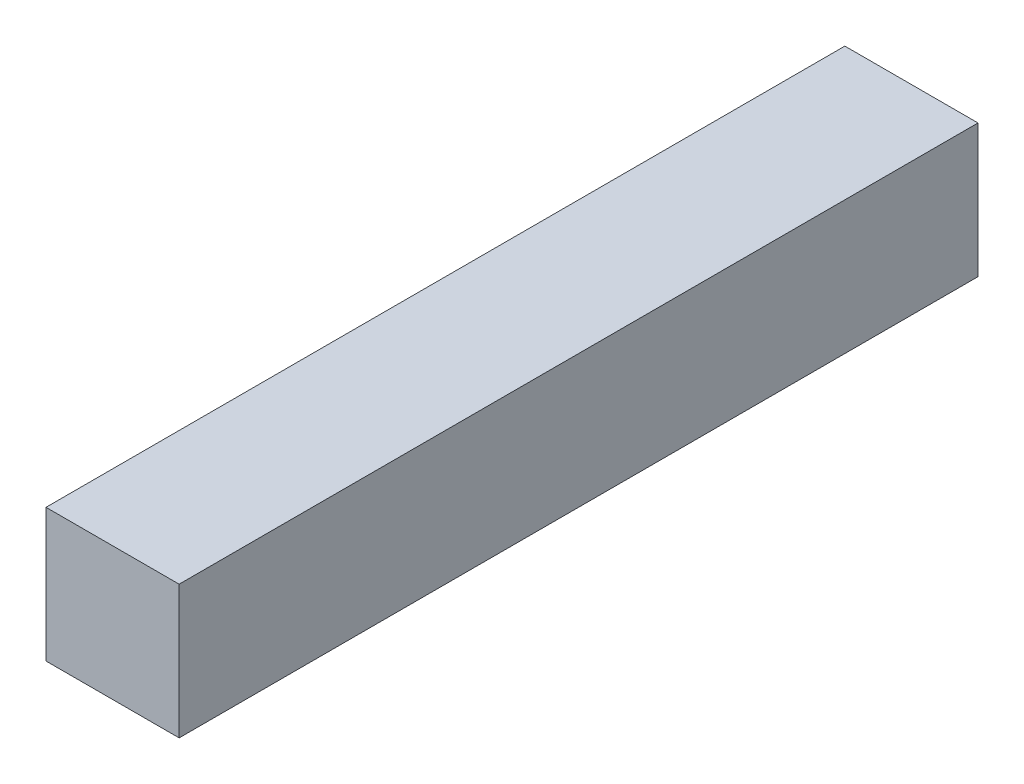
ISO-10303-21;
HEADER;
FILE_DESCRIPTION(('STEP AP214'),'2;1');
FILE_NAME('part.step','',(''),(''),'','','');
FILE_SCHEMA(('AUTOMOTIVE_DESIGN { 1 0 10303 214 1 1 1 1 }'));
ENDSEC;
DATA;
#1=APPLICATION_CONTEXT('core data for automotive mechanical design processes');
#2=APPLICATION_PROTOCOL_DEFINITION('international standard','automotive_design',2000,#1);
#3=PRODUCT_CONTEXT('',#1,'mechanical');
#4=PRODUCT('Part','Part','',(#3));
#5=PRODUCT_RELATED_PRODUCT_CATEGORY('part','',(#4));
#6=PRODUCT_DEFINITION_FORMATION('','',#4);
#7=PRODUCT_DEFINITION_CONTEXT('part definition',#1,'design');
#8=PRODUCT_DEFINITION('design','',#6,#7);
#9=PRODUCT_DEFINITION_SHAPE('','',#8);
#10=(LENGTH_UNIT() NAMED_UNIT(*) SI_UNIT(.MILLI.,.METRE.));
#11=(NAMED_UNIT(*) PLANE_ANGLE_UNIT() SI_UNIT($,.RADIAN.));
#12=(NAMED_UNIT(*) SI_UNIT($,.STERADIAN.) SOLID_ANGLE_UNIT());
#13=UNCERTAINTY_MEASURE_WITH_UNIT(LENGTH_MEASURE(1.E-05),#10,'distance_accuracy_value','');
#14=(GEOMETRIC_REPRESENTATION_CONTEXT(3) GLOBAL_UNCERTAINTY_ASSIGNED_CONTEXT((#13)) GLOBAL_UNIT_ASSIGNED_CONTEXT((#10,
#11,#12)) REPRESENTATION_CONTEXT('',''));
#15=CARTESIAN_POINT('',(0.,0.,0.));
#16=DIRECTION('',(0.,0.,1.));
#17=DIRECTION('',(1.,0.,0.));
#18=AXIS2_PLACEMENT_3D('',#15,#16,#17);
#19=CARTESIAN_POINT('',(10.,-10.,120.));
#20=DIRECTION('',(-1.,0.,0.));
#21=DIRECTION('',(0.,0.,1.));
#22=AXIS2_PLACEMENT_3D('',#19,#20,#21);
#23=PLANE('',#22);
#24=DIRECTION('',(0.,1.,0.));
#25=VECTOR('',#24,1.);
#26=CARTESIAN_POINT('',(10.,-10.,0.));
#27=LINE('',#26,#25);
#28=CARTESIAN_POINT('',(10.,-10.,0.));
#29=VERTEX_POINT('',#28);
#30=CARTESIAN_POINT('',(10.,10.,0.));
#31=VERTEX_POINT('',#30);
#32=EDGE_CURVE('E96',#29,#31,#27,.T.);
#33=ORIENTED_EDGE('',*,*,#32,.T.);
#34=DIRECTION('',(0.,0.,-1.));
#35=VECTOR('',#34,1.);
#36=CARTESIAN_POINT('',(10.,10.,120.));
#37=LINE('',#36,#35);
#38=CARTESIAN_POINT('',(10.,10.,120.));
#39=VERTEX_POINT('',#38);
#40=EDGE_CURVE('E11',#39,#31,#37,.T.);
#41=ORIENTED_EDGE('',*,*,#40,.F.);
#42=DIRECTION('',(0.,1.,0.));
#43=VECTOR('',#42,1.);
#44=CARTESIAN_POINT('',(10.,-10.,120.));
#45=LINE('',#44,#43);
#46=CARTESIAN_POINT('',(10.,-10.,120.));
#47=VERTEX_POINT('',#46);
#48=EDGE_CURVE('E84',#47,#39,#45,.T.);
#49=ORIENTED_EDGE('',*,*,#48,.F.);
#50=DIRECTION('',(0.,0.,-1.));
#51=VECTOR('',#50,1.);
#52=CARTESIAN_POINT('',(10.,-10.,120.));
#53=LINE('',#52,#51);
#54=EDGE_CURVE('E92',#47,#29,#53,.T.);
#55=ORIENTED_EDGE('',*,*,#54,.T.);
#56=EDGE_LOOP('',(#33,#41,#49,#55));
#57=FACE_BOUND('',#56,.T.);
#58=ADVANCED_FACE('F33',(#57),#23,.F.);
#59=CARTESIAN_POINT('',(-10.,10.,120.));
#60=DIRECTION('',(0.,-1.,0.));
#61=DIRECTION('',(0.,0.,-1.));
#62=AXIS2_PLACEMENT_3D('',#59,#60,#61);
#63=PLANE('',#62);
#64=DIRECTION('',(-1.,0.,0.));
#65=VECTOR('',#64,1.);
#66=CARTESIAN_POINT('',(-10.,10.,0.));
#67=LINE('',#66,#65);
#68=CARTESIAN_POINT('',(-10.,10.,0.));
#69=VERTEX_POINT('',#68);
#70=EDGE_CURVE('E88',#31,#69,#67,.T.);
#71=ORIENTED_EDGE('',*,*,#70,.T.);
#72=DIRECTION('',(0.,0.,-1.));
#73=VECTOR('',#72,1.);
#74=CARTESIAN_POINT('',(-10.,10.,120.));
#75=LINE('',#74,#73);
#76=CARTESIAN_POINT('',(-10.,10.,120.));
#77=VERTEX_POINT('',#76);
#78=EDGE_CURVE('E41',#77,#69,#75,.T.);
#79=ORIENTED_EDGE('',*,*,#78,.F.);
#80=DIRECTION('',(-1.,0.,0.));
#81=VECTOR('',#80,1.);
#82=CARTESIAN_POINT('',(-10.,10.,120.));
#83=LINE('',#82,#81);
#84=EDGE_CURVE('E79',#39,#77,#83,.T.);
#85=ORIENTED_EDGE('',*,*,#84,.F.);
#86=ORIENTED_EDGE('',*,*,#40,.T.);
#87=EDGE_LOOP('',(#71,#79,#85,#86));
#88=FACE_BOUND('',#87,.T.);
#89=ADVANCED_FACE('F87',(#88),#63,.F.);
#90=CARTESIAN_POINT('',(-10.,-10.,120.));
#91=DIRECTION('',(1.,0.,0.));
#92=DIRECTION('',(0.,0.,-1.));
#93=AXIS2_PLACEMENT_3D('',#90,#91,#92);
#94=PLANE('',#93);
#95=DIRECTION('',(0.,-1.,0.));
#96=VECTOR('',#95,1.);
#97=CARTESIAN_POINT('',(-10.,-10.,0.));
#98=LINE('',#97,#96);
#99=CARTESIAN_POINT('',(-10.,-10.,0.));
#100=VERTEX_POINT('',#99);
#101=EDGE_CURVE('E66',#69,#100,#98,.T.);
#102=ORIENTED_EDGE('',*,*,#101,.T.);
#103=DIRECTION('',(0.,0.,-1.));
#104=VECTOR('',#103,1.);
#105=CARTESIAN_POINT('',(-10.,-10.,120.));
#106=LINE('',#105,#104);
#107=CARTESIAN_POINT('',(-10.,-10.,120.));
#108=VERTEX_POINT('',#107);
#109=EDGE_CURVE('E89',#108,#100,#106,.T.);
#110=ORIENTED_EDGE('',*,*,#109,.F.);
#111=DIRECTION('',(0.,-1.,0.));
#112=VECTOR('',#111,1.);
#113=CARTESIAN_POINT('',(-10.,-10.,120.));
#114=LINE('',#113,#112);
#115=EDGE_CURVE('E82',#77,#108,#114,.T.);
#116=ORIENTED_EDGE('',*,*,#115,.F.);
#117=ORIENTED_EDGE('',*,*,#78,.T.);
#118=EDGE_LOOP('',(#102,#110,#116,#117));
#119=FACE_BOUND('',#118,.T.);
#120=ADVANCED_FACE('F90',(#119),#94,.F.);
#121=CARTESIAN_POINT('',(-10.,-10.,120.));
#122=DIRECTION('',(0.,1.,0.));
#123=DIRECTION('',(0.,0.,1.));
#124=AXIS2_PLACEMENT_3D('',#121,#122,#123);
#125=PLANE('',#124);
#126=DIRECTION('',(1.,0.,0.));
#127=VECTOR('',#126,1.);
#128=CARTESIAN_POINT('',(-10.,-10.,0.));
#129=LINE('',#128,#127);
#130=EDGE_CURVE('E72',#100,#29,#129,.T.);
#131=ORIENTED_EDGE('',*,*,#130,.T.);
#132=ORIENTED_EDGE('',*,*,#54,.F.);
#133=DIRECTION('',(1.,0.,0.));
#134=VECTOR('',#133,1.);
#135=CARTESIAN_POINT('',(-10.,-10.,120.));
#136=LINE('',#135,#134);
#137=EDGE_CURVE('E49',#108,#47,#136,.T.);
#138=ORIENTED_EDGE('',*,*,#137,.F.);
#139=ORIENTED_EDGE('',*,*,#109,.T.);
#140=EDGE_LOOP('',(#131,#132,#138,#139));
#141=FACE_BOUND('',#140,.T.);
#142=ADVANCED_FACE('F103',(#141),#125,.F.);
#143=CARTESIAN_POINT('',(0.,0.,120.));
#144=DIRECTION('',(0.,0.,-1.));
#145=DIRECTION('',(-1.,0.,0.));
#146=AXIS2_PLACEMENT_3D('',#143,#144,#145);
#147=PLANE('',#146);
#148=ORIENTED_EDGE('',*,*,#48,.T.);
#149=ORIENTED_EDGE('',*,*,#84,.T.);
#150=ORIENTED_EDGE('',*,*,#115,.T.);
#151=ORIENTED_EDGE('',*,*,#137,.T.);
#152=EDGE_LOOP('',(#148,#149,#150,#151));
#153=FACE_BOUND('',#152,.T.);
#154=ADVANCED_FACE('F80',(#153),#147,.F.);
#155=CARTESIAN_POINT('',(0.,0.,0.));
#156=DIRECTION('',(0.,0.,-1.));
#157=DIRECTION('',(-1.,0.,0.));
#158=AXIS2_PLACEMENT_3D('',#155,#156,#157);
#159=PLANE('',#158);
#160=ORIENTED_EDGE('',*,*,#32,.F.);
#161=ORIENTED_EDGE('',*,*,#130,.F.);
#162=ORIENTED_EDGE('',*,*,#101,.F.);
#163=ORIENTED_EDGE('',*,*,#70,.F.);
#164=EDGE_LOOP('',(#160,#161,#162,#163));
#165=FACE_BOUND('',#164,.T.);
#166=ADVANCED_FACE('F106',(#165),#159,.T.);
#167=CLOSED_SHELL('',(#58,#89,#120,#142,#154,#166));
#168=MANIFOLD_SOLID_BREP('B2',#167);
#169=ADVANCED_BREP_SHAPE_REPRESENTATION('',(#18,#168),#14);
#170=SHAPE_DEFINITION_REPRESENTATION(#9,#169);
ENDSEC;
END-ISO-10303-21;
